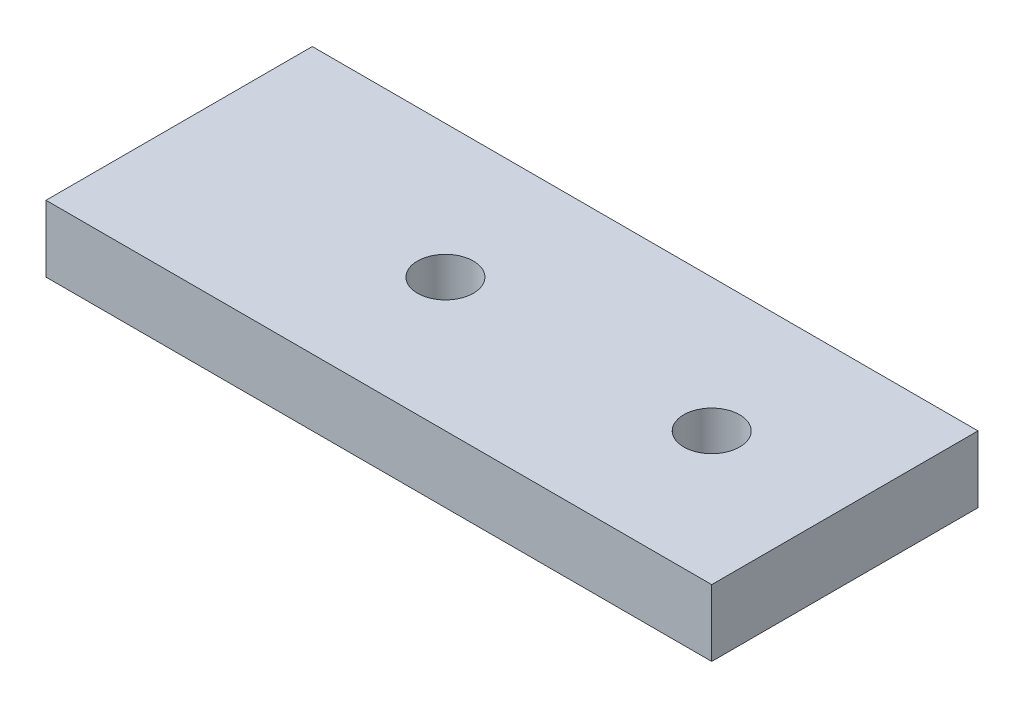
ISO-10303-21;
HEADER;
FILE_DESCRIPTION(('STEP AP214'),'2;1');
FILE_NAME('part.step','',(''),(''),'','','');
FILE_SCHEMA(('AUTOMOTIVE_DESIGN { 1 0 10303 214 1 1 1 1 }'));
ENDSEC;
DATA;
#1=APPLICATION_CONTEXT('core data for automotive mechanical design processes');
#2=APPLICATION_PROTOCOL_DEFINITION('international standard','automotive_design',2000,#1);
#3=PRODUCT_CONTEXT('',#1,'mechanical');
#4=PRODUCT('Part','Part','',(#3));
#5=PRODUCT_RELATED_PRODUCT_CATEGORY('part','',(#4));
#6=PRODUCT_DEFINITION_FORMATION('','',#4);
#7=PRODUCT_DEFINITION_CONTEXT('part definition',#1,'design');
#8=PRODUCT_DEFINITION('design','',#6,#7);
#9=PRODUCT_DEFINITION_SHAPE('','',#8);
#10=(LENGTH_UNIT() NAMED_UNIT(*) SI_UNIT(.MILLI.,.METRE.));
#11=(NAMED_UNIT(*) PLANE_ANGLE_UNIT() SI_UNIT($,.RADIAN.));
#12=(NAMED_UNIT(*) SI_UNIT($,.STERADIAN.) SOLID_ANGLE_UNIT());
#13=UNCERTAINTY_MEASURE_WITH_UNIT(LENGTH_MEASURE(1.E-05),#10,'distance_accuracy_value','');
#14=(GEOMETRIC_REPRESENTATION_CONTEXT(3) GLOBAL_UNCERTAINTY_ASSIGNED_CONTEXT((#13)) GLOBAL_UNIT_ASSIGNED_CONTEXT((#10,
#11,#12)) REPRESENTATION_CONTEXT('',''));
#15=CARTESIAN_POINT('',(0.,0.,0.));
#16=DIRECTION('',(0.,0.,1.));
#17=DIRECTION('',(1.,0.,0.));
#18=AXIS2_PLACEMENT_3D('',#15,#16,#17);
#19=CARTESIAN_POINT('',(0.,6.35,0.));
#20=DIRECTION('',(1.,0.,0.));
#21=DIRECTION('',(0.,0.,-1.));
#22=AXIS2_PLACEMENT_3D('',#19,#20,#21);
#23=PLANE('',#22);
#24=DIRECTION('',(0.,0.,1.));
#25=VECTOR('',#24,1.);
#26=CARTESIAN_POINT('',(0.,0.,0.));
#27=LINE('',#26,#25);
#28=CARTESIAN_POINT('',(0.,0.,-25.4));
#29=VERTEX_POINT('',#28);
#30=CARTESIAN_POINT('',(0.,0.,0.));
#31=VERTEX_POINT('',#30);
#32=EDGE_CURVE('E96',#29,#31,#27,.T.);
#33=ORIENTED_EDGE('',*,*,#32,.T.);
#34=DIRECTION('',(0.,-1.,0.));
#35=VECTOR('',#34,1.);
#36=CARTESIAN_POINT('',(0.,6.35,0.));
#37=LINE('',#36,#35);
#38=CARTESIAN_POINT('',(0.,6.35,0.));
#39=VERTEX_POINT('',#38);
#40=EDGE_CURVE('E11',#39,#31,#37,.T.);
#41=ORIENTED_EDGE('',*,*,#40,.F.);
#42=DIRECTION('',(0.,0.,1.));
#43=VECTOR('',#42,1.);
#44=CARTESIAN_POINT('',(0.,6.35,0.));
#45=LINE('',#44,#43);
#46=CARTESIAN_POINT('',(0.,6.35,-25.4));
#47=VERTEX_POINT('',#46);
#48=EDGE_CURVE('E84',#47,#39,#45,.T.);
#49=ORIENTED_EDGE('',*,*,#48,.F.);
#50=DIRECTION('',(0.,-1.,0.));
#51=VECTOR('',#50,1.);
#52=CARTESIAN_POINT('',(0.,6.35,-25.4));
#53=LINE('',#52,#51);
#54=EDGE_CURVE('E92',#47,#29,#53,.T.);
#55=ORIENTED_EDGE('',*,*,#54,.T.);
#56=EDGE_LOOP('',(#33,#41,#49,#55));
#57=FACE_BOUND('',#56,.T.);
#58=ADVANCED_FACE('F33',(#57),#23,.F.);
#59=CARTESIAN_POINT('',(0.,6.35,0.));
#60=DIRECTION('',(0.,0.,-1.));
#61=DIRECTION('',(-1.,0.,0.));
#62=AXIS2_PLACEMENT_3D('',#59,#60,#61);
#63=PLANE('',#62);
#64=DIRECTION('',(1.,0.,0.));
#65=VECTOR('',#64,1.);
#66=CARTESIAN_POINT('',(0.,0.,0.));
#67=LINE('',#66,#65);
#68=CARTESIAN_POINT('',(63.5,0.,0.));
#69=VERTEX_POINT('',#68);
#70=EDGE_CURVE('E88',#31,#69,#67,.T.);
#71=ORIENTED_EDGE('',*,*,#70,.T.);
#72=DIRECTION('',(0.,-1.,0.));
#73=VECTOR('',#72,1.);
#74=CARTESIAN_POINT('',(63.5,6.35,0.));
#75=LINE('',#74,#73);
#76=CARTESIAN_POINT('',(63.5,6.35,0.));
#77=VERTEX_POINT('',#76);
#78=EDGE_CURVE('E41',#77,#69,#75,.T.);
#79=ORIENTED_EDGE('',*,*,#78,.F.);
#80=DIRECTION('',(1.,0.,0.));
#81=VECTOR('',#80,1.);
#82=CARTESIAN_POINT('',(0.,6.35,0.));
#83=LINE('',#82,#81);
#84=EDGE_CURVE('E79',#39,#77,#83,.T.);
#85=ORIENTED_EDGE('',*,*,#84,.F.);
#86=ORIENTED_EDGE('',*,*,#40,.T.);
#87=EDGE_LOOP('',(#71,#79,#85,#86));
#88=FACE_BOUND('',#87,.T.);
#89=ADVANCED_FACE('F87',(#88),#63,.F.);
#90=CARTESIAN_POINT('',(63.5,6.35,0.));
#91=DIRECTION('',(-1.,0.,0.));
#92=DIRECTION('',(0.,0.,1.));
#93=AXIS2_PLACEMENT_3D('',#90,#91,#92);
#94=PLANE('',#93);
#95=DIRECTION('',(0.,0.,-1.));
#96=VECTOR('',#95,1.);
#97=CARTESIAN_POINT('',(63.5,0.,0.));
#98=LINE('',#97,#96);
#99=CARTESIAN_POINT('',(63.5,0.,-25.4));
#100=VERTEX_POINT('',#99);
#101=EDGE_CURVE('E66',#69,#100,#98,.T.);
#102=ORIENTED_EDGE('',*,*,#101,.T.);
#103=DIRECTION('',(0.,-1.,0.));
#104=VECTOR('',#103,1.);
#105=CARTESIAN_POINT('',(63.5,6.35,-25.4));
#106=LINE('',#105,#104);
#107=CARTESIAN_POINT('',(63.5,6.35,-25.4));
#108=VERTEX_POINT('',#107);
#109=EDGE_CURVE('E89',#108,#100,#106,.T.);
#110=ORIENTED_EDGE('',*,*,#109,.F.);
#111=DIRECTION('',(0.,0.,-1.));
#112=VECTOR('',#111,1.);
#113=CARTESIAN_POINT('',(63.5,6.35,0.));
#114=LINE('',#113,#112);
#115=EDGE_CURVE('E82',#77,#108,#114,.T.);
#116=ORIENTED_EDGE('',*,*,#115,.F.);
#117=ORIENTED_EDGE('',*,*,#78,.T.);
#118=EDGE_LOOP('',(#102,#110,#116,#117));
#119=FACE_BOUND('',#118,.T.);
#120=ADVANCED_FACE('F90',(#119),#94,.F.);
#121=CARTESIAN_POINT('',(0.,6.35,-25.4));
#122=DIRECTION('',(0.,0.,1.));
#123=DIRECTION('',(1.,0.,0.));
#124=AXIS2_PLACEMENT_3D('',#121,#122,#123);
#125=PLANE('',#124);
#126=DIRECTION('',(-1.,0.,0.));
#127=VECTOR('',#126,1.);
#128=CARTESIAN_POINT('',(0.,0.,-25.4));
#129=LINE('',#128,#127);
#130=EDGE_CURVE('E72',#100,#29,#129,.T.);
#131=ORIENTED_EDGE('',*,*,#130,.T.);
#132=ORIENTED_EDGE('',*,*,#54,.F.);
#133=DIRECTION('',(-1.,0.,0.));
#134=VECTOR('',#133,1.);
#135=CARTESIAN_POINT('',(0.,6.35,-25.4));
#136=LINE('',#135,#134);
#137=EDGE_CURVE('E49',#108,#47,#136,.T.);
#138=ORIENTED_EDGE('',*,*,#137,.F.);
#139=ORIENTED_EDGE('',*,*,#109,.T.);
#140=EDGE_LOOP('',(#131,#132,#138,#139));
#141=FACE_BOUND('',#140,.T.);
#142=ADVANCED_FACE('F104',(#141),#125,.F.);
#143=CARTESIAN_POINT('',(0.,6.35,0.));
#144=DIRECTION('',(0.,-1.,0.));
#145=DIRECTION('',(0.,0.,-1.));
#146=AXIS2_PLACEMENT_3D('',#143,#144,#145);
#147=PLANE('',#146);
#148=CARTESIAN_POINT('',(50.8,6.35,-12.7));
#149=DIRECTION('',(0.,1.,0.));
#150=DIRECTION('',(0.,0.,1.));
#151=AXIS2_PLACEMENT_3D('',#148,#149,#150);
#152=CIRCLE('',#151,2.667);
#153=CARTESIAN_POINT('',(50.8,6.35,-10.033));
#154=VERTEX_POINT('',#153);
#155=EDGE_CURVE('E116',#154,#154,#152,.T.);
#156=ORIENTED_EDGE('',*,*,#155,.F.);
#157=EDGE_LOOP('',(#156));
#158=FACE_BOUND('',#157,.T.);
#159=CARTESIAN_POINT('',(25.4,6.35,-12.7));
#160=DIRECTION('',(0.,1.,0.));
#161=DIRECTION('',(0.,0.,1.));
#162=AXIS2_PLACEMENT_3D('',#159,#160,#161);
#163=CIRCLE('',#162,2.667);
#164=CARTESIAN_POINT('',(25.4,6.35,-10.033));
#165=VERTEX_POINT('',#164);
#166=EDGE_CURVE('E110',#165,#165,#163,.T.);
#167=ORIENTED_EDGE('',*,*,#166,.F.);
#168=EDGE_LOOP('',(#167));
#169=FACE_BOUND('',#168,.T.);
#170=ORIENTED_EDGE('',*,*,#48,.T.);
#171=ORIENTED_EDGE('',*,*,#84,.T.);
#172=ORIENTED_EDGE('',*,*,#115,.T.);
#173=ORIENTED_EDGE('',*,*,#137,.T.);
#174=EDGE_LOOP('',(#170,#171,#172,#173));
#175=FACE_BOUND('',#174,.T.);
#176=ADVANCED_FACE('F80',(#158,#169,#175),#147,.F.);
#177=CARTESIAN_POINT('',(0.,0.,0.));
#178=DIRECTION('',(0.,-1.,0.));
#179=DIRECTION('',(0.,0.,-1.));
#180=AXIS2_PLACEMENT_3D('',#177,#178,#179);
#181=PLANE('',#180);
#182=CARTESIAN_POINT('',(50.8,0.,-12.7));
#183=DIRECTION('',(0.,1.,0.));
#184=DIRECTION('',(0.,0.,1.));
#185=AXIS2_PLACEMENT_3D('',#182,#183,#184);
#186=CIRCLE('',#185,2.667);
#187=CARTESIAN_POINT('',(50.8,0.,-10.033));
#188=VERTEX_POINT('',#187);
#189=EDGE_CURVE('E113',#188,#188,#186,.T.);
#190=ORIENTED_EDGE('',*,*,#189,.T.);
#191=EDGE_LOOP('',(#190));
#192=FACE_BOUND('',#191,.T.);
#193=CARTESIAN_POINT('',(25.4,0.,-12.7));
#194=DIRECTION('',(0.,1.,0.));
#195=DIRECTION('',(0.,0.,1.));
#196=AXIS2_PLACEMENT_3D('',#193,#194,#195);
#197=CIRCLE('',#196,2.667);
#198=CARTESIAN_POINT('',(25.4,0.,-10.033));
#199=VERTEX_POINT('',#198);
#200=EDGE_CURVE('E99',#199,#199,#197,.T.);
#201=ORIENTED_EDGE('',*,*,#200,.T.);
#202=EDGE_LOOP('',(#201));
#203=FACE_BOUND('',#202,.T.);
#204=ORIENTED_EDGE('',*,*,#32,.F.);
#205=ORIENTED_EDGE('',*,*,#130,.F.);
#206=ORIENTED_EDGE('',*,*,#101,.F.);
#207=ORIENTED_EDGE('',*,*,#70,.F.);
#208=EDGE_LOOP('',(#204,#205,#206,#207));
#209=FACE_BOUND('',#208,.T.);
#210=ADVANCED_FACE('F107',(#192,#203,#209),#181,.T.);
#211=CARTESIAN_POINT('',(25.4,0.,-12.7));
#212=DIRECTION('',(0.,1.,0.));
#213=DIRECTION('',(0.,0.,1.));
#214=AXIS2_PLACEMENT_3D('',#211,#212,#213);
#215=CYLINDRICAL_SURFACE('',#214,2.667);
#216=ORIENTED_EDGE('',*,*,#200,.F.);
#217=EDGE_LOOP('',(#216));
#218=FACE_BOUND('',#217,.T.);
#219=ORIENTED_EDGE('',*,*,#166,.T.);
#220=EDGE_LOOP('',(#219));
#221=FACE_BOUND('',#220,.T.);
#222=ADVANCED_FACE('F127',(#218,#221),#215,.F.);
#223=CARTESIAN_POINT('',(50.8,0.,-12.7));
#224=DIRECTION('',(0.,1.,0.));
#225=DIRECTION('',(0.,0.,1.));
#226=AXIS2_PLACEMENT_3D('',#223,#224,#225);
#227=CYLINDRICAL_SURFACE('',#226,2.667);
#228=ORIENTED_EDGE('',*,*,#189,.F.);
#229=EDGE_LOOP('',(#228));
#230=FACE_BOUND('',#229,.T.);
#231=ORIENTED_EDGE('',*,*,#155,.T.);
#232=EDGE_LOOP('',(#231));
#233=FACE_BOUND('',#232,.T.);
#234=ADVANCED_FACE('F124',(#230,#233),#227,.F.);
#235=CLOSED_SHELL('',(#58,#89,#120,#142,#176,#210,#222,#234));
#236=MANIFOLD_SOLID_BREP('B2',#235);
#237=ADVANCED_BREP_SHAPE_REPRESENTATION('',(#18,#236),#14);
#238=SHAPE_DEFINITION_REPRESENTATION(#9,#237);
ENDSEC;
END-ISO-10303-21;
